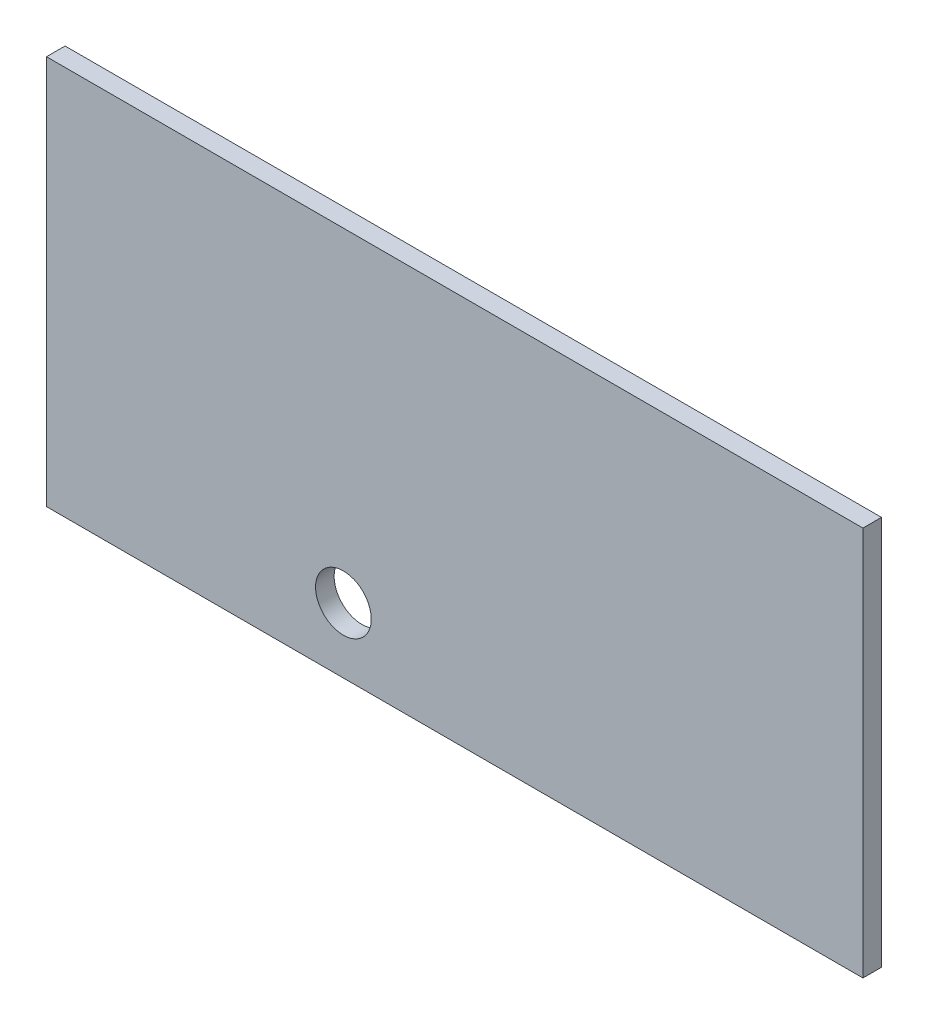
ISO-10303-21;
HEADER;
FILE_DESCRIPTION(('STEP AP214'),'2;1');
FILE_NAME('part.step','',(''),(''),'','','');
FILE_SCHEMA(('AUTOMOTIVE_DESIGN { 1 0 10303 214 1 1 1 1 }'));
ENDSEC;
DATA;
#1=APPLICATION_CONTEXT('core data for automotive mechanical design processes');
#2=APPLICATION_PROTOCOL_DEFINITION('international standard','automotive_design',2000,#1);
#3=PRODUCT_CONTEXT('',#1,'mechanical');
#4=PRODUCT('Part','Part','',(#3));
#5=PRODUCT_RELATED_PRODUCT_CATEGORY('part','',(#4));
#6=PRODUCT_DEFINITION_FORMATION('','',#4);
#7=PRODUCT_DEFINITION_CONTEXT('part definition',#1,'design');
#8=PRODUCT_DEFINITION('design','',#6,#7);
#9=PRODUCT_DEFINITION_SHAPE('','',#8);
#10=(LENGTH_UNIT() NAMED_UNIT(*) SI_UNIT(.MILLI.,.METRE.));
#11=(NAMED_UNIT(*) PLANE_ANGLE_UNIT() SI_UNIT($,.RADIAN.));
#12=(NAMED_UNIT(*) SI_UNIT($,.STERADIAN.) SOLID_ANGLE_UNIT());
#13=UNCERTAINTY_MEASURE_WITH_UNIT(LENGTH_MEASURE(1.E-05),#10,'distance_accuracy_value','');
#14=(GEOMETRIC_REPRESENTATION_CONTEXT(3) GLOBAL_UNCERTAINTY_ASSIGNED_CONTEXT((#13)) GLOBAL_UNIT_ASSIGNED_CONTEXT((#10,
#11,#12)) REPRESENTATION_CONTEXT('',''));
#15=CARTESIAN_POINT('',(0.,0.,0.));
#16=DIRECTION('',(0.,0.,1.));
#17=DIRECTION('',(1.,0.,0.));
#18=AXIS2_PLACEMENT_3D('',#15,#16,#17);
#19=CARTESIAN_POINT('',(3.501555E-11,722.832012286213,-382.357743681072));
#20=DIRECTION('',(0.,0.,1.));
#21=DIRECTION('',(1.,0.,0.));
#22=AXIS2_PLACEMENT_3D('',#19,#20,#21);
#23=PLANE('',#22);
#24=CARTESIAN_POINT('',(-5.99999999996226,715.832012286214,-382.357743681072));
#25=DIRECTION('',(0.,0.,-1.));
#26=DIRECTION('',(-1.,0.,0.));
#27=AXIS2_PLACEMENT_3D('',#24,#25,#26);
#28=CIRCLE('',#27,1.5);
#29=CARTESIAN_POINT('',(-7.49999999996226,715.832012286214,-382.357743681072));
#30=VERTEX_POINT('',#29);
#31=EDGE_CURVE('E20',#30,#30,#28,.F.);
#32=ORIENTED_EDGE('',*,*,#31,.T.);
#33=EDGE_LOOP('',(#32));
#34=FACE_BOUND('',#33,.T.);
#35=DIRECTION('',(5.204884E-13,1.,0.));
#36=VECTOR('',#35,1.);
#37=CARTESIAN_POINT('',(22.0000000000377,733.332012286211,-382.357743681072));
#38=LINE('',#37,#36);
#39=CARTESIAN_POINT('',(22.0000000000268,712.332012286212,-382.357743681072));
#40=VERTEX_POINT('',#39);
#41=CARTESIAN_POINT('',(22.000000000035,733.332012286211,-382.357743681072));
#42=VERTEX_POINT('',#41);
#43=EDGE_CURVE('E59',#40,#42,#38,.T.);
#44=ORIENTED_EDGE('',*,*,#43,.F.);
#45=DIRECTION('',(1.,0.,0.));
#46=VECTOR('',#45,1.);
#47=CARTESIAN_POINT('',(22.0000000000268,712.332012286211,-382.357743681072));
#48=LINE('',#47,#46);
#49=CARTESIAN_POINT('',(-21.9999999999615,712.332012286212,-382.357743681072));
#50=VERTEX_POINT('',#49);
#51=EDGE_CURVE('E82',#50,#40,#48,.T.);
#52=ORIENTED_EDGE('',*,*,#51,.F.);
#53=DIRECTION('',(0.,1.,0.));
#54=VECTOR('',#53,1.);
#55=CARTESIAN_POINT('',(-21.9999999999613,712.332012286212,-382.357743681072));
#56=LINE('',#55,#54);
#57=CARTESIAN_POINT('',(-21.999999999962,733.332012286212,-382.357743681072));
#58=VERTEX_POINT('',#57);
#59=EDGE_CURVE('E69',#58,#50,#56,.F.);
#60=ORIENTED_EDGE('',*,*,#59,.F.);
#61=DIRECTION('',(1.,0.,0.));
#62=VECTOR('',#61,1.);
#63=CARTESIAN_POINT('',(-21.9999999999623,733.332012286212,-382.357743681072));
#64=LINE('',#63,#62);
#65=EDGE_CURVE('E54',#42,#58,#64,.F.);
#66=ORIENTED_EDGE('',*,*,#65,.F.);
#67=EDGE_LOOP('',(#44,#52,#60,#66));
#68=FACE_BOUND('',#67,.T.);
#69=ADVANCED_FACE('F17',(#34,#68),#23,.F.);
#70=CARTESIAN_POINT('',(22.0000000000377,733.332012286211,-382.357743681072));
#71=DIRECTION('',(1.,-5.204884E-13,0.));
#72=DIRECTION('',(5.204884E-13,1.,0.));
#73=AXIS2_PLACEMENT_3D('',#70,#71,#72);
#74=PLANE('',#73);
#75=ORIENTED_EDGE('',*,*,#43,.T.);
#76=DIRECTION('',(0.,0.,1.));
#77=VECTOR('',#76,1.);
#78=CARTESIAN_POINT('',(22.0000000000377,733.332012286212,-382.357743681072));
#79=LINE('',#78,#77);
#80=CARTESIAN_POINT('',(22.000000000035,733.332012286211,-381.357743681072));
#81=VERTEX_POINT('',#80);
#82=EDGE_CURVE('E61',#81,#42,#79,.F.);
#83=ORIENTED_EDGE('',*,*,#82,.F.);
#84=DIRECTION('',(0.,1.,0.));
#85=VECTOR('',#84,1.);
#86=CARTESIAN_POINT('',(22.0000000000268,722.832012286213,-381.357743681072));
#87=LINE('',#86,#85);
#88=CARTESIAN_POINT('',(22.0000000000268,712.332012286211,-381.357743681072));
#89=VERTEX_POINT('',#88);
#90=EDGE_CURVE('E85',#89,#81,#87,.T.);
#91=ORIENTED_EDGE('',*,*,#90,.F.);
#92=DIRECTION('',(0.,0.,-1.));
#93=VECTOR('',#92,1.);
#94=CARTESIAN_POINT('',(22.0000000000268,712.332012286211,-382.357743681072));
#95=LINE('',#94,#93);
#96=EDGE_CURVE('E64',#40,#89,#95,.F.);
#97=ORIENTED_EDGE('',*,*,#96,.F.);
#98=EDGE_LOOP('',(#75,#83,#91,#97));
#99=FACE_BOUND('',#98,.T.);
#100=ADVANCED_FACE('F60',(#99),#74,.T.);
#101=CARTESIAN_POINT('',(-21.9999999999623,733.332012286212,-382.357743681072));
#102=DIRECTION('',(0.,1.,0.));
#103=DIRECTION('',(0.,0.,1.));
#104=AXIS2_PLACEMENT_3D('',#101,#102,#103);
#105=PLANE('',#104);
#106=ORIENTED_EDGE('',*,*,#65,.T.);
#107=DIRECTION('',(0.,0.,1.));
#108=VECTOR('',#107,1.);
#109=CARTESIAN_POINT('',(-21.9999999999613,733.332012286212,-382.357743681072));
#110=LINE('',#109,#108);
#111=CARTESIAN_POINT('',(-21.999999999962,733.332012286212,-381.357743681072));
#112=VERTEX_POINT('',#111);
#113=EDGE_CURVE('E71',#112,#58,#110,.F.);
#114=ORIENTED_EDGE('',*,*,#113,.F.);
#115=DIRECTION('',(1.,0.,0.));
#116=VECTOR('',#115,1.);
#117=CARTESIAN_POINT('',(3.501555E-11,733.332012286211,-381.357743681072));
#118=LINE('',#117,#116);
#119=EDGE_CURVE('E75',#81,#112,#118,.F.);
#120=ORIENTED_EDGE('',*,*,#119,.F.);
#121=ORIENTED_EDGE('',*,*,#82,.T.);
#122=EDGE_LOOP('',(#106,#114,#120,#121));
#123=FACE_BOUND('',#122,.T.);
#124=ADVANCED_FACE('F73',(#123),#105,.T.);
#125=CARTESIAN_POINT('',(-21.9999999999613,712.332012286212,-382.357743681072));
#126=DIRECTION('',(-1.,0.,0.));
#127=DIRECTION('',(0.,0.,1.));
#128=AXIS2_PLACEMENT_3D('',#125,#126,#127);
#129=PLANE('',#128);
#130=ORIENTED_EDGE('',*,*,#59,.T.);
#131=DIRECTION('',(0.,0.,-1.));
#132=VECTOR('',#131,1.);
#133=CARTESIAN_POINT('',(-21.9999999999613,712.332012286211,-382.357743681072));
#134=LINE('',#133,#132);
#135=CARTESIAN_POINT('',(-21.9999999999615,712.332012286212,-381.357743681072));
#136=VERTEX_POINT('',#135);
#137=EDGE_CURVE('E34',#136,#50,#134,.T.);
#138=ORIENTED_EDGE('',*,*,#137,.F.);
#139=DIRECTION('',(0.,1.,0.));
#140=VECTOR('',#139,1.);
#141=CARTESIAN_POINT('',(-21.9999999999623,722.832012286213,-381.357743681072));
#142=LINE('',#141,#140);
#143=EDGE_CURVE('E88',#112,#136,#142,.F.);
#144=ORIENTED_EDGE('',*,*,#143,.F.);
#145=ORIENTED_EDGE('',*,*,#113,.T.);
#146=EDGE_LOOP('',(#130,#138,#144,#145));
#147=FACE_BOUND('',#146,.T.);
#148=ADVANCED_FACE('F98',(#147),#129,.T.);
#149=CARTESIAN_POINT('',(22.0000000000268,712.332012286211,-382.357743681072));
#150=DIRECTION('',(0.,-1.,0.));
#151=DIRECTION('',(0.,0.,-1.));
#152=AXIS2_PLACEMENT_3D('',#149,#150,#151);
#153=PLANE('',#152);
#154=ORIENTED_EDGE('',*,*,#51,.T.);
#155=ORIENTED_EDGE('',*,*,#96,.T.);
#156=DIRECTION('',(1.,0.,0.));
#157=VECTOR('',#156,1.);
#158=CARTESIAN_POINT('',(3.501555E-11,712.332012286212,-381.357743681072));
#159=LINE('',#158,#157);
#160=EDGE_CURVE('E26',#136,#89,#159,.T.);
#161=ORIENTED_EDGE('',*,*,#160,.F.);
#162=ORIENTED_EDGE('',*,*,#137,.T.);
#163=EDGE_LOOP('',(#154,#155,#161,#162));
#164=FACE_BOUND('',#163,.T.);
#165=ADVANCED_FACE('F95',(#164),#153,.T.);
#166=CARTESIAN_POINT('',(-5.99999999996226,715.832012286214,-381.857743681072));
#167=DIRECTION('',(0.,0.,-1.));
#168=DIRECTION('',(-1.,0.,0.));
#169=AXIS2_PLACEMENT_3D('',#166,#167,#168);
#170=CYLINDRICAL_SURFACE('',#169,1.5);
#171=CARTESIAN_POINT('',(-5.99999999996226,715.832012286214,-381.357743681072));
#172=DIRECTION('',(0.,0.,-1.));
#173=DIRECTION('',(-1.,0.,0.));
#174=AXIS2_PLACEMENT_3D('',#171,#172,#173);
#175=CIRCLE('',#174,1.5);
#176=CARTESIAN_POINT('',(-7.49999999996226,715.832012286214,-381.357743681072));
#177=VERTEX_POINT('',#176);
#178=EDGE_CURVE('E11',#177,#177,#175,.T.);
#179=ORIENTED_EDGE('',*,*,#178,.F.);
#180=EDGE_LOOP('',(#179));
#181=FACE_BOUND('',#180,.T.);
#182=ORIENTED_EDGE('',*,*,#31,.F.);
#183=EDGE_LOOP('',(#182));
#184=FACE_BOUND('',#183,.T.);
#185=ADVANCED_FACE('F97',(#181,#184),#170,.F.);
#186=CARTESIAN_POINT('',(3.501555E-11,722.832012286213,-381.357743681072));
#187=DIRECTION('',(0.,0.,1.));
#188=DIRECTION('',(1.,0.,0.));
#189=AXIS2_PLACEMENT_3D('',#186,#187,#188);
#190=PLANE('',#189);
#191=ORIENTED_EDGE('',*,*,#178,.T.);
#192=EDGE_LOOP('',(#191));
#193=FACE_BOUND('',#192,.T.);
#194=ORIENTED_EDGE('',*,*,#143,.T.);
#195=ORIENTED_EDGE('',*,*,#160,.T.);
#196=ORIENTED_EDGE('',*,*,#90,.T.);
#197=ORIENTED_EDGE('',*,*,#119,.T.);
#198=EDGE_LOOP('',(#194,#195,#196,#197));
#199=FACE_BOUND('',#198,.T.);
#200=ADVANCED_FACE('F93',(#193,#199),#190,.T.);
#201=CLOSED_SHELL('',(#69,#100,#124,#148,#165,#185,#200));
#202=MANIFOLD_SOLID_BREP('B1',#201);
#203=ADVANCED_BREP_SHAPE_REPRESENTATION('',(#18,#202),#14);
#204=SHAPE_DEFINITION_REPRESENTATION(#9,#203);
ENDSEC;
END-ISO-10303-21;
